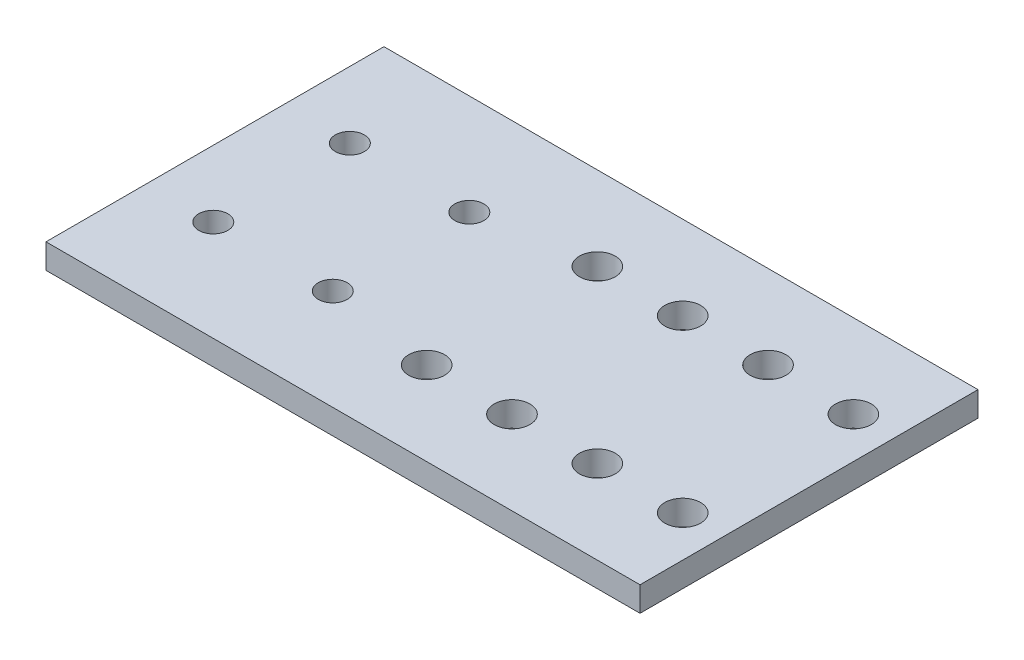
ISO-10303-21;
HEADER;
FILE_DESCRIPTION(('STEP AP214'),'2;1');
FILE_NAME('part.step','',(''),(''),'','','');
FILE_SCHEMA(('AUTOMOTIVE_DESIGN { 1 0 10303 214 1 1 1 1 }'));
ENDSEC;
DATA;
#1=APPLICATION_CONTEXT('core data for automotive mechanical design processes');
#2=APPLICATION_PROTOCOL_DEFINITION('international standard','automotive_design',2000,#1);
#3=PRODUCT_CONTEXT('',#1,'mechanical');
#4=PRODUCT('Part','Part','',(#3));
#5=PRODUCT_RELATED_PRODUCT_CATEGORY('part','',(#4));
#6=PRODUCT_DEFINITION_FORMATION('','',#4);
#7=PRODUCT_DEFINITION_CONTEXT('part definition',#1,'design');
#8=PRODUCT_DEFINITION('design','',#6,#7);
#9=PRODUCT_DEFINITION_SHAPE('','',#8);
#10=(LENGTH_UNIT() NAMED_UNIT(*) SI_UNIT(.MILLI.,.METRE.));
#11=(NAMED_UNIT(*) PLANE_ANGLE_UNIT() SI_UNIT($,.RADIAN.));
#12=(NAMED_UNIT(*) SI_UNIT($,.STERADIAN.) SOLID_ANGLE_UNIT());
#13=UNCERTAINTY_MEASURE_WITH_UNIT(LENGTH_MEASURE(1.E-05),#10,'distance_accuracy_value','');
#14=(GEOMETRIC_REPRESENTATION_CONTEXT(3) GLOBAL_UNCERTAINTY_ASSIGNED_CONTEXT((#13)) GLOBAL_UNIT_ASSIGNED_CONTEXT((#10,
#11,#12)) REPRESENTATION_CONTEXT('',''));
#15=CARTESIAN_POINT('',(0.,0.,0.));
#16=DIRECTION('',(0.,0.,1.));
#17=DIRECTION('',(1.,0.,0.));
#18=AXIS2_PLACEMENT_3D('',#15,#16,#17);
#19=CARTESIAN_POINT('',(0.,2.9,0.));
#20=DIRECTION('',(0.,1.,0.));
#21=DIRECTION('',(0.,0.,1.));
#22=AXIS2_PLACEMENT_3D('',#19,#20,#21);
#23=PLANE('',#22);
#24=CARTESIAN_POINT('',(-5.00000000000025,2.9,-110.));
#25=DIRECTION('',(0.,1.,0.));
#26=DIRECTION('',(0.,0.,1.));
#27=AXIS2_PLACEMENT_3D('',#24,#25,#26);
#28=CIRCLE('',#27,2.1);
#29=CARTESIAN_POINT('',(-5.00000000000025,2.9,-107.9));
#30=VERTEX_POINT('',#29);
#31=EDGE_CURVE('E141',#30,#30,#28,.T.);
#32=ORIENTED_EDGE('',*,*,#31,.F.);
#33=EDGE_LOOP('',(#32));
#34=FACE_BOUND('',#33,.T.);
#35=CARTESIAN_POINT('',(-15.0000000000003,2.9,-110.));
#36=DIRECTION('',(0.,1.,0.));
#37=DIRECTION('',(0.,0.,1.));
#38=AXIS2_PLACEMENT_3D('',#35,#36,#37);
#39=CIRCLE('',#38,2.1);
#40=CARTESIAN_POINT('',(-15.0000000000003,2.9,-107.9));
#41=VERTEX_POINT('',#40);
#42=EDGE_CURVE('E161',#41,#41,#39,.T.);
#43=ORIENTED_EDGE('',*,*,#42,.F.);
#44=EDGE_LOOP('',(#43));
#45=FACE_BOUND('',#44,.T.);
#46=CARTESIAN_POINT('',(-5.00000000000025,2.9,-90.));
#47=DIRECTION('',(0.,1.,0.));
#48=DIRECTION('',(0.,0.,1.));
#49=AXIS2_PLACEMENT_3D('',#46,#47,#48);
#50=CIRCLE('',#49,2.1);
#51=CARTESIAN_POINT('',(-5.00000000000025,2.9,-87.9));
#52=VERTEX_POINT('',#51);
#53=EDGE_CURVE('E157',#52,#52,#50,.F.);
#54=ORIENTED_EDGE('',*,*,#53,.T.);
#55=EDGE_LOOP('',(#54));
#56=FACE_BOUND('',#55,.T.);
#57=CARTESIAN_POINT('',(-15.0000000000003,2.9,-90.));
#58=DIRECTION('',(0.,1.,0.));
#59=DIRECTION('',(0.,0.,1.));
#60=AXIS2_PLACEMENT_3D('',#57,#58,#59);
#61=CIRCLE('',#60,2.1);
#62=CARTESIAN_POINT('',(-15.0000000000003,2.9,-87.9));
#63=VERTEX_POINT('',#62);
#64=EDGE_CURVE('E132',#63,#63,#61,.F.);
#65=ORIENTED_EDGE('',*,*,#64,.T.);
#66=EDGE_LOOP('',(#65));
#67=FACE_BOUND('',#66,.T.);
#68=CARTESIAN_POINT('',(-25.,2.9,-90.));
#69=DIRECTION('',(0.,1.,0.));
#70=DIRECTION('',(0.,0.,1.));
#71=AXIS2_PLACEMENT_3D('',#68,#69,#70);
#72=CIRCLE('',#71,2.1);
#73=CARTESIAN_POINT('',(-25.,2.9,-87.9));
#74=VERTEX_POINT('',#73);
#75=EDGE_CURVE('E181',#74,#74,#72,.F.);
#76=ORIENTED_EDGE('',*,*,#75,.T.);
#77=EDGE_LOOP('',(#76));
#78=FACE_BOUND('',#77,.T.);
#79=CARTESIAN_POINT('',(-62.,2.9,-108.));
#80=DIRECTION('',(0.,1.,0.));
#81=DIRECTION('',(0.,0.,1.));
#82=AXIS2_PLACEMENT_3D('',#79,#80,#81);
#83=CIRCLE('',#82,1.7);
#84=CARTESIAN_POINT('',(-62.,2.9,-106.3));
#85=VERTEX_POINT('',#84);
#86=EDGE_CURVE('E11',#85,#85,#83,.F.);
#87=ORIENTED_EDGE('',*,*,#86,.T.);
#88=EDGE_LOOP('',(#87));
#89=FACE_BOUND('',#88,.T.);
#90=CARTESIAN_POINT('',(-48.,2.9,-92.));
#91=DIRECTION('',(0.,1.,0.));
#92=DIRECTION('',(0.,0.,1.));
#93=AXIS2_PLACEMENT_3D('',#90,#91,#92);
#94=CIRCLE('',#93,1.7);
#95=CARTESIAN_POINT('',(-48.,2.9,-90.3));
#96=VERTEX_POINT('',#95);
#97=EDGE_CURVE('E57',#96,#96,#94,.T.);
#98=ORIENTED_EDGE('',*,*,#97,.F.);
#99=EDGE_LOOP('',(#98));
#100=FACE_BOUND('',#99,.T.);
#101=CARTESIAN_POINT('',(-48.,2.9,-108.));
#102=DIRECTION('',(0.,1.,0.));
#103=DIRECTION('',(0.,0.,1.));
#104=AXIS2_PLACEMENT_3D('',#101,#102,#103);
#105=CIRCLE('',#104,1.7);
#106=CARTESIAN_POINT('',(-48.,2.9,-106.3));
#107=VERTEX_POINT('',#106);
#108=EDGE_CURVE('E204',#107,#107,#105,.F.);
#109=ORIENTED_EDGE('',*,*,#108,.T.);
#110=EDGE_LOOP('',(#109));
#111=FACE_BOUND('',#110,.T.);
#112=CARTESIAN_POINT('',(-62.,2.9,-92.));
#113=DIRECTION('',(0.,1.,0.));
#114=DIRECTION('',(0.,0.,1.));
#115=AXIS2_PLACEMENT_3D('',#112,#113,#114);
#116=CIRCLE('',#115,1.7);
#117=CARTESIAN_POINT('',(-62.,2.9,-90.3));
#118=VERTEX_POINT('',#117);
#119=EDGE_CURVE('E200',#118,#118,#116,.T.);
#120=ORIENTED_EDGE('',*,*,#119,.F.);
#121=EDGE_LOOP('',(#120));
#122=FACE_BOUND('',#121,.T.);
#123=CARTESIAN_POINT('',(-35.,2.9,-110.));
#124=DIRECTION('',(0.,1.,0.));
#125=DIRECTION('',(0.,0.,1.));
#126=AXIS2_PLACEMENT_3D('',#123,#124,#125);
#127=CIRCLE('',#126,2.1);
#128=CARTESIAN_POINT('',(-35.,2.9,-107.9));
#129=VERTEX_POINT('',#128);
#130=EDGE_CURVE('E172',#129,#129,#127,.T.);
#131=ORIENTED_EDGE('',*,*,#130,.F.);
#132=EDGE_LOOP('',(#131));
#133=FACE_BOUND('',#132,.T.);
#134=CARTESIAN_POINT('',(-35.,2.9,-89.9999999999999));
#135=DIRECTION('',(0.,1.,0.));
#136=DIRECTION('',(0.,0.,1.));
#137=AXIS2_PLACEMENT_3D('',#134,#135,#136);
#138=CIRCLE('',#137,2.1);
#139=CARTESIAN_POINT('',(-35.,2.9,-87.8999999999999));
#140=VERTEX_POINT('',#139);
#141=EDGE_CURVE('E173',#140,#140,#138,.F.);
#142=ORIENTED_EDGE('',*,*,#141,.T.);
#143=EDGE_LOOP('',(#142));
#144=FACE_BOUND('',#143,.T.);
#145=CARTESIAN_POINT('',(-25.0000000000003,2.9,-110.));
#146=DIRECTION('',(0.,1.,0.));
#147=DIRECTION('',(0.,0.,1.));
#148=AXIS2_PLACEMENT_3D('',#145,#146,#147);
#149=CIRCLE('',#148,2.10000000000022);
#150=CARTESIAN_POINT('',(-25.0000000000003,2.9,-107.9));
#151=VERTEX_POINT('',#150);
#152=EDGE_CURVE('E153',#151,#151,#149,.T.);
#153=ORIENTED_EDGE('',*,*,#152,.F.);
#154=EDGE_LOOP('',(#153));
#155=FACE_BOUND('',#154,.T.);
#156=DIRECTION('',(0.,0.,-1.));
#157=VECTOR('',#156,1.);
#158=CARTESIAN_POINT('',(-0.200000000000033,2.9,-119.8));
#159=LINE('',#158,#157);
#160=CARTESIAN_POINT('',(-0.200000000000028,2.9,-80.2));
#161=VERTEX_POINT('',#160);
#162=CARTESIAN_POINT('',(-0.200000000000033,2.9,-119.8));
#163=VERTEX_POINT('',#162);
#164=EDGE_CURVE('E97',#161,#163,#159,.T.);
#165=ORIENTED_EDGE('',*,*,#164,.T.);
#166=DIRECTION('',(-1.,0.,0.));
#167=VECTOR('',#166,1.);
#168=CARTESIAN_POINT('',(-69.8,2.9,-119.8));
#169=LINE('',#168,#167);
#170=CARTESIAN_POINT('',(-69.8,2.9,-119.8));
#171=VERTEX_POINT('',#170);
#172=EDGE_CURVE('E119',#163,#171,#169,.T.);
#173=ORIENTED_EDGE('',*,*,#172,.T.);
#174=DIRECTION('',(0.,0.,1.));
#175=VECTOR('',#174,1.);
#176=CARTESIAN_POINT('',(-69.8,2.9,-119.8));
#177=LINE('',#176,#175);
#178=CARTESIAN_POINT('',(-69.8,2.9,-80.2));
#179=VERTEX_POINT('',#178);
#180=EDGE_CURVE('E123',#171,#179,#177,.T.);
#181=ORIENTED_EDGE('',*,*,#180,.T.);
#182=DIRECTION('',(1.,0.,0.));
#183=VECTOR('',#182,1.);
#184=CARTESIAN_POINT('',(-69.8,2.9,-80.2));
#185=LINE('',#184,#183);
#186=EDGE_CURVE('E65',#179,#161,#185,.T.);
#187=ORIENTED_EDGE('',*,*,#186,.T.);
#188=EDGE_LOOP('',(#165,#173,#181,#187));
#189=FACE_BOUND('',#188,.T.);
#190=ADVANCED_FACE('F47',(#34,#45,#56,#67,#78,#89,#100,#111,#122,#133,#144,#155,#189),#23,.T.);
#191=CARTESIAN_POINT('',(0.,0.,0.));
#192=DIRECTION('',(0.,1.,0.));
#193=DIRECTION('',(0.,0.,1.));
#194=AXIS2_PLACEMENT_3D('',#191,#192,#193);
#195=PLANE('',#194);
#196=CARTESIAN_POINT('',(-5.00000000000025,0.,-110.));
#197=DIRECTION('',(0.,1.,0.));
#198=DIRECTION('',(0.,0.,1.));
#199=AXIS2_PLACEMENT_3D('',#196,#197,#198);
#200=CIRCLE('',#199,2.1);
#201=CARTESIAN_POINT('',(-5.00000000000025,0.,-107.9));
#202=VERTEX_POINT('',#201);
#203=EDGE_CURVE('E149',#202,#202,#200,.T.);
#204=ORIENTED_EDGE('',*,*,#203,.T.);
#205=EDGE_LOOP('',(#204));
#206=FACE_BOUND('',#205,.T.);
#207=CARTESIAN_POINT('',(-15.0000000000003,0.,-110.));
#208=DIRECTION('',(0.,1.,0.));
#209=DIRECTION('',(0.,0.,1.));
#210=AXIS2_PLACEMENT_3D('',#207,#208,#209);
#211=CIRCLE('',#210,2.1);
#212=CARTESIAN_POINT('',(-15.0000000000003,0.,-107.9));
#213=VERTEX_POINT('',#212);
#214=EDGE_CURVE('E145',#213,#213,#211,.T.);
#215=ORIENTED_EDGE('',*,*,#214,.T.);
#216=EDGE_LOOP('',(#215));
#217=FACE_BOUND('',#216,.T.);
#218=CARTESIAN_POINT('',(-5.00000000000025,0.,-90.));
#219=DIRECTION('',(0.,1.,0.));
#220=DIRECTION('',(0.,0.,1.));
#221=AXIS2_PLACEMENT_3D('',#218,#219,#220);
#222=CIRCLE('',#221,2.1);
#223=CARTESIAN_POINT('',(-5.00000000000025,0.,-87.9));
#224=VERTEX_POINT('',#223);
#225=EDGE_CURVE('E140',#224,#224,#222,.F.);
#226=ORIENTED_EDGE('',*,*,#225,.F.);
#227=EDGE_LOOP('',(#226));
#228=FACE_BOUND('',#227,.T.);
#229=CARTESIAN_POINT('',(-15.0000000000003,0.,-90.));
#230=DIRECTION('',(0.,1.,0.));
#231=DIRECTION('',(0.,0.,1.));
#232=AXIS2_PLACEMENT_3D('',#229,#230,#231);
#233=CIRCLE('',#232,2.1);
#234=CARTESIAN_POINT('',(-15.0000000000003,0.,-87.9));
#235=VERTEX_POINT('',#234);
#236=EDGE_CURVE('E136',#235,#235,#233,.F.);
#237=ORIENTED_EDGE('',*,*,#236,.F.);
#238=EDGE_LOOP('',(#237));
#239=FACE_BOUND('',#238,.T.);
#240=CARTESIAN_POINT('',(-25.,0.,-90.));
#241=DIRECTION('',(0.,1.,0.));
#242=DIRECTION('',(0.,0.,1.));
#243=AXIS2_PLACEMENT_3D('',#240,#241,#242);
#244=CIRCLE('',#243,2.1);
#245=CARTESIAN_POINT('',(-25.,0.,-87.9));
#246=VERTEX_POINT('',#245);
#247=EDGE_CURVE('E177',#246,#246,#244,.F.);
#248=ORIENTED_EDGE('',*,*,#247,.F.);
#249=EDGE_LOOP('',(#248));
#250=FACE_BOUND('',#249,.T.);
#251=CARTESIAN_POINT('',(-35.,0.,-89.9999999999999));
#252=DIRECTION('',(0.,1.,0.));
#253=DIRECTION('',(0.,0.,1.));
#254=AXIS2_PLACEMENT_3D('',#251,#252,#253);
#255=CIRCLE('',#254,2.1);
#256=CARTESIAN_POINT('',(-35.,0.,-87.8999999999999));
#257=VERTEX_POINT('',#256);
#258=EDGE_CURVE('E168',#257,#257,#255,.F.);
#259=ORIENTED_EDGE('',*,*,#258,.F.);
#260=EDGE_LOOP('',(#259));
#261=FACE_BOUND('',#260,.T.);
#262=CARTESIAN_POINT('',(-62.,0.,-108.));
#263=DIRECTION('',(0.,1.,0.));
#264=DIRECTION('',(0.,0.,1.));
#265=AXIS2_PLACEMENT_3D('',#262,#263,#264);
#266=CIRCLE('',#265,1.7);
#267=CARTESIAN_POINT('',(-62.,0.,-106.3));
#268=VERTEX_POINT('',#267);
#269=EDGE_CURVE('E51',#268,#268,#266,.F.);
#270=ORIENTED_EDGE('',*,*,#269,.F.);
#271=EDGE_LOOP('',(#270));
#272=FACE_BOUND('',#271,.T.);
#273=CARTESIAN_POINT('',(-48.,0.,-92.));
#274=DIRECTION('',(0.,1.,0.));
#275=DIRECTION('',(0.,0.,1.));
#276=AXIS2_PLACEMENT_3D('',#273,#274,#275);
#277=CIRCLE('',#276,1.7);
#278=CARTESIAN_POINT('',(-48.,0.,-90.3));
#279=VERTEX_POINT('',#278);
#280=EDGE_CURVE('E217',#279,#279,#277,.T.);
#281=ORIENTED_EDGE('',*,*,#280,.T.);
#282=EDGE_LOOP('',(#281));
#283=FACE_BOUND('',#282,.T.);
#284=CARTESIAN_POINT('',(-48.,0.,-108.));
#285=DIRECTION('',(0.,1.,0.));
#286=DIRECTION('',(0.,0.,1.));
#287=AXIS2_PLACEMENT_3D('',#284,#285,#286);
#288=CIRCLE('',#287,1.7);
#289=CARTESIAN_POINT('',(-48.,0.,-106.3));
#290=VERTEX_POINT('',#289);
#291=EDGE_CURVE('E214',#290,#290,#288,.F.);
#292=ORIENTED_EDGE('',*,*,#291,.F.);
#293=EDGE_LOOP('',(#292));
#294=FACE_BOUND('',#293,.T.);
#295=CARTESIAN_POINT('',(-62.,0.,-92.));
#296=DIRECTION('',(0.,1.,0.));
#297=DIRECTION('',(0.,0.,1.));
#298=AXIS2_PLACEMENT_3D('',#295,#296,#297);
#299=CIRCLE('',#298,1.7);
#300=CARTESIAN_POINT('',(-62.,0.,-90.3));
#301=VERTEX_POINT('',#300);
#302=EDGE_CURVE('E196',#301,#301,#299,.T.);
#303=ORIENTED_EDGE('',*,*,#302,.T.);
#304=EDGE_LOOP('',(#303));
#305=FACE_BOUND('',#304,.T.);
#306=CARTESIAN_POINT('',(-35.,0.,-110.));
#307=DIRECTION('',(0.,1.,0.));
#308=DIRECTION('',(0.,0.,1.));
#309=AXIS2_PLACEMENT_3D('',#306,#307,#308);
#310=CIRCLE('',#309,2.1);
#311=CARTESIAN_POINT('',(-35.,0.,-107.9));
#312=VERTEX_POINT('',#311);
#313=EDGE_CURVE('E192',#312,#312,#310,.T.);
#314=ORIENTED_EDGE('',*,*,#313,.T.);
#315=EDGE_LOOP('',(#314));
#316=FACE_BOUND('',#315,.T.);
#317=CARTESIAN_POINT('',(-25.0000000000003,0.,-110.));
#318=DIRECTION('',(0.,1.,0.));
#319=DIRECTION('',(0.,0.,1.));
#320=AXIS2_PLACEMENT_3D('',#317,#318,#319);
#321=CIRCLE('',#320,2.10000000000022);
#322=CARTESIAN_POINT('',(-25.0000000000003,0.,-107.9));
#323=VERTEX_POINT('',#322);
#324=EDGE_CURVE('E185',#323,#323,#321,.T.);
#325=ORIENTED_EDGE('',*,*,#324,.T.);
#326=EDGE_LOOP('',(#325));
#327=FACE_BOUND('',#326,.T.);
#328=DIRECTION('',(-1.,0.,0.));
#329=VECTOR('',#328,1.);
#330=CARTESIAN_POINT('',(-69.8,0.,-119.8));
#331=LINE('',#330,#329);
#332=CARTESIAN_POINT('',(-0.200000000000033,0.,-119.8));
#333=VERTEX_POINT('',#332);
#334=CARTESIAN_POINT('',(-69.8,0.,-119.8));
#335=VERTEX_POINT('',#334);
#336=EDGE_CURVE('E73',#333,#335,#331,.T.);
#337=ORIENTED_EDGE('',*,*,#336,.F.);
#338=DIRECTION('',(0.,0.,-1.));
#339=VECTOR('',#338,1.);
#340=CARTESIAN_POINT('',(-0.200000000000033,0.,-119.8));
#341=LINE('',#340,#339);
#342=CARTESIAN_POINT('',(-0.200000000000028,0.,-80.2));
#343=VERTEX_POINT('',#342);
#344=EDGE_CURVE('E95',#343,#333,#341,.T.);
#345=ORIENTED_EDGE('',*,*,#344,.F.);
#346=DIRECTION('',(1.,0.,0.));
#347=VECTOR('',#346,1.);
#348=CARTESIAN_POINT('',(-69.8,0.,-80.2));
#349=LINE('',#348,#347);
#350=CARTESIAN_POINT('',(-69.8,0.,-80.2));
#351=VERTEX_POINT('',#350);
#352=EDGE_CURVE('E103',#351,#343,#349,.T.);
#353=ORIENTED_EDGE('',*,*,#352,.F.);
#354=DIRECTION('',(0.,0.,1.));
#355=VECTOR('',#354,1.);
#356=CARTESIAN_POINT('',(-69.8,0.,-119.8));
#357=LINE('',#356,#355);
#358=EDGE_CURVE('E109',#335,#351,#357,.T.);
#359=ORIENTED_EDGE('',*,*,#358,.F.);
#360=EDGE_LOOP('',(#337,#345,#353,#359));
#361=FACE_BOUND('',#360,.T.);
#362=ADVANCED_FACE('F111',(#206,#217,#228,#239,#250,#261,#272,#283,#294,#305,#316,#327,#361),
#195,.F.);
#363=CARTESIAN_POINT('',(-48.,2.9,-92.));
#364=DIRECTION('',(0.,-1.,0.));
#365=DIRECTION('',(0.,0.,-1.));
#366=AXIS2_PLACEMENT_3D('',#363,#364,#365);
#367=CYLINDRICAL_SURFACE('',#366,1.7);
#368=ORIENTED_EDGE('',*,*,#97,.T.);
#369=EDGE_LOOP('',(#368));
#370=FACE_BOUND('',#369,.T.);
#371=ORIENTED_EDGE('',*,*,#280,.F.);
#372=EDGE_LOOP('',(#371));
#373=FACE_BOUND('',#372,.T.);
#374=ADVANCED_FACE('F229',(#370,#373),#367,.F.);
#375=CARTESIAN_POINT('',(-48.,2.9,-108.));
#376=DIRECTION('',(0.,-1.,0.));
#377=DIRECTION('',(0.,0.,-1.));
#378=AXIS2_PLACEMENT_3D('',#375,#376,#377);
#379=CYLINDRICAL_SURFACE('',#378,1.7);
#380=ORIENTED_EDGE('',*,*,#108,.F.);
#381=EDGE_LOOP('',(#380));
#382=FACE_BOUND('',#381,.T.);
#383=ORIENTED_EDGE('',*,*,#291,.T.);
#384=EDGE_LOOP('',(#383));
#385=FACE_BOUND('',#384,.T.);
#386=ADVANCED_FACE('F300',(#382,#385),#379,.F.);
#387=CARTESIAN_POINT('',(-62.,2.9,-92.));
#388=DIRECTION('',(0.,-1.,0.));
#389=DIRECTION('',(0.,0.,-1.));
#390=AXIS2_PLACEMENT_3D('',#387,#388,#389);
#391=CYLINDRICAL_SURFACE('',#390,1.7);
#392=ORIENTED_EDGE('',*,*,#119,.T.);
#393=EDGE_LOOP('',(#392));
#394=FACE_BOUND('',#393,.T.);
#395=ORIENTED_EDGE('',*,*,#302,.F.);
#396=EDGE_LOOP('',(#395));
#397=FACE_BOUND('',#396,.T.);
#398=ADVANCED_FACE('F49',(#394,#397),#391,.F.);
#399=CARTESIAN_POINT('',(-62.,2.9,-108.));
#400=DIRECTION('',(0.,-1.,0.));
#401=DIRECTION('',(0.,0.,-1.));
#402=AXIS2_PLACEMENT_3D('',#399,#400,#401);
#403=CYLINDRICAL_SURFACE('',#402,1.7);
#404=ORIENTED_EDGE('',*,*,#86,.F.);
#405=EDGE_LOOP('',(#404));
#406=FACE_BOUND('',#405,.T.);
#407=ORIENTED_EDGE('',*,*,#269,.T.);
#408=EDGE_LOOP('',(#407));
#409=FACE_BOUND('',#408,.T.);
#410=ADVANCED_FACE('F226',(#406,#409),#403,.F.);
#411=CARTESIAN_POINT('',(-35.,0.,-110.));
#412=DIRECTION('',(0.,1.,0.));
#413=DIRECTION('',(0.,0.,1.));
#414=AXIS2_PLACEMENT_3D('',#411,#412,#413);
#415=CYLINDRICAL_SURFACE('',#414,2.1);
#416=ORIENTED_EDGE('',*,*,#313,.F.);
#417=EDGE_LOOP('',(#416));
#418=FACE_BOUND('',#417,.T.);
#419=ORIENTED_EDGE('',*,*,#130,.T.);
#420=EDGE_LOOP('',(#419));
#421=FACE_BOUND('',#420,.T.);
#422=ADVANCED_FACE('F288',(#418,#421),#415,.F.);
#423=CARTESIAN_POINT('',(-35.,0.,-89.9999999999999));
#424=DIRECTION('',(0.,1.,0.));
#425=DIRECTION('',(0.,0.,1.));
#426=AXIS2_PLACEMENT_3D('',#423,#424,#425);
#427=CYLINDRICAL_SURFACE('',#426,2.1);
#428=ORIENTED_EDGE('',*,*,#258,.T.);
#429=EDGE_LOOP('',(#428));
#430=FACE_BOUND('',#429,.T.);
#431=ORIENTED_EDGE('',*,*,#141,.F.);
#432=EDGE_LOOP('',(#431));
#433=FACE_BOUND('',#432,.T.);
#434=ADVANCED_FACE('F285',(#430,#433),#427,.F.);
#435=CARTESIAN_POINT('',(-25.,0.,-90.));
#436=DIRECTION('',(0.,1.,0.));
#437=DIRECTION('',(0.,0.,1.));
#438=AXIS2_PLACEMENT_3D('',#435,#436,#437);
#439=CYLINDRICAL_SURFACE('',#438,2.1);
#440=ORIENTED_EDGE('',*,*,#247,.T.);
#441=EDGE_LOOP('',(#440));
#442=FACE_BOUND('',#441,.T.);
#443=ORIENTED_EDGE('',*,*,#75,.F.);
#444=EDGE_LOOP('',(#443));
#445=FACE_BOUND('',#444,.T.);
#446=ADVANCED_FACE('F245',(#442,#445),#439,.F.);
#447=CARTESIAN_POINT('',(-25.0000000000003,0.,-110.));
#448=DIRECTION('',(0.,1.,0.));
#449=DIRECTION('',(0.,0.,1.));
#450=AXIS2_PLACEMENT_3D('',#447,#448,#449);
#451=CYLINDRICAL_SURFACE('',#450,2.10000000000022);
#452=ORIENTED_EDGE('',*,*,#324,.F.);
#453=EDGE_LOOP('',(#452));
#454=FACE_BOUND('',#453,.T.);
#455=ORIENTED_EDGE('',*,*,#152,.T.);
#456=EDGE_LOOP('',(#455));
#457=FACE_BOUND('',#456,.T.);
#458=ADVANCED_FACE('F241',(#454,#457),#451,.F.);
#459=CARTESIAN_POINT('',(-15.0000000000003,0.,-110.));
#460=DIRECTION('',(0.,1.,0.));
#461=DIRECTION('',(0.,0.,1.));
#462=AXIS2_PLACEMENT_3D('',#459,#460,#461);
#463=CYLINDRICAL_SURFACE('',#462,2.1);
#464=ORIENTED_EDGE('',*,*,#214,.F.);
#465=EDGE_LOOP('',(#464));
#466=FACE_BOUND('',#465,.T.);
#467=ORIENTED_EDGE('',*,*,#42,.T.);
#468=EDGE_LOOP('',(#467));
#469=FACE_BOUND('',#468,.T.);
#470=ADVANCED_FACE('F244',(#466,#469),#463,.F.);
#471=CARTESIAN_POINT('',(-5.00000000000025,0.,-90.));
#472=DIRECTION('',(0.,1.,0.));
#473=DIRECTION('',(0.,0.,1.));
#474=AXIS2_PLACEMENT_3D('',#471,#472,#473);
#475=CYLINDRICAL_SURFACE('',#474,2.1);
#476=ORIENTED_EDGE('',*,*,#225,.T.);
#477=EDGE_LOOP('',(#476));
#478=FACE_BOUND('',#477,.T.);
#479=ORIENTED_EDGE('',*,*,#53,.F.);
#480=EDGE_LOOP('',(#479));
#481=FACE_BOUND('',#480,.T.);
#482=ADVANCED_FACE('F277',(#478,#481),#475,.F.);
#483=CARTESIAN_POINT('',(-15.0000000000003,0.,-90.));
#484=DIRECTION('',(0.,1.,0.));
#485=DIRECTION('',(0.,0.,1.));
#486=AXIS2_PLACEMENT_3D('',#483,#484,#485);
#487=CYLINDRICAL_SURFACE('',#486,2.1);
#488=ORIENTED_EDGE('',*,*,#236,.T.);
#489=EDGE_LOOP('',(#488));
#490=FACE_BOUND('',#489,.T.);
#491=ORIENTED_EDGE('',*,*,#64,.F.);
#492=EDGE_LOOP('',(#491));
#493=FACE_BOUND('',#492,.T.);
#494=ADVANCED_FACE('F269',(#490,#493),#487,.F.);
#495=CARTESIAN_POINT('',(-5.00000000000025,0.,-110.));
#496=DIRECTION('',(0.,1.,0.));
#497=DIRECTION('',(0.,0.,1.));
#498=AXIS2_PLACEMENT_3D('',#495,#496,#497);
#499=CYLINDRICAL_SURFACE('',#498,2.1);
#500=ORIENTED_EDGE('',*,*,#203,.F.);
#501=EDGE_LOOP('',(#500));
#502=FACE_BOUND('',#501,.T.);
#503=ORIENTED_EDGE('',*,*,#31,.T.);
#504=EDGE_LOOP('',(#503));
#505=FACE_BOUND('',#504,.T.);
#506=ADVANCED_FACE('F262',(#502,#505),#499,.F.);
#507=CARTESIAN_POINT('',(-69.8,0.,-119.8));
#508=DIRECTION('',(0.,0.,-1.));
#509=DIRECTION('',(-1.,0.,0.));
#510=AXIS2_PLACEMENT_3D('',#507,#508,#509);
#511=PLANE('',#510);
#512=ORIENTED_EDGE('',*,*,#172,.F.);
#513=DIRECTION('',(0.,1.,0.));
#514=VECTOR('',#513,1.);
#515=CARTESIAN_POINT('',(-0.200000000000033,0.,-119.8));
#516=LINE('',#515,#514);
#517=EDGE_CURVE('E99',#333,#163,#516,.T.);
#518=ORIENTED_EDGE('',*,*,#517,.F.);
#519=ORIENTED_EDGE('',*,*,#336,.T.);
#520=DIRECTION('',(0.,1.,0.));
#521=VECTOR('',#520,1.);
#522=CARTESIAN_POINT('',(-69.8,0.,-119.8));
#523=LINE('',#522,#521);
#524=EDGE_CURVE('E113',#335,#171,#523,.T.);
#525=ORIENTED_EDGE('',*,*,#524,.T.);
#526=EDGE_LOOP('',(#512,#518,#519,#525));
#527=FACE_BOUND('',#526,.T.);
#528=ADVANCED_FACE('F260',(#527),#511,.T.);
#529=CARTESIAN_POINT('',(-0.200000000000033,0.,-119.8));
#530=DIRECTION('',(1.,0.,0.));
#531=DIRECTION('',(0.,0.,-1.));
#532=AXIS2_PLACEMENT_3D('',#529,#530,#531);
#533=PLANE('',#532);
#534=ORIENTED_EDGE('',*,*,#164,.F.);
#535=DIRECTION('',(0.,1.,0.));
#536=VECTOR('',#535,1.);
#537=CARTESIAN_POINT('',(-0.200000000000028,0.,-80.2));
#538=LINE('',#537,#536);
#539=EDGE_CURVE('E91',#343,#161,#538,.T.);
#540=ORIENTED_EDGE('',*,*,#539,.F.);
#541=ORIENTED_EDGE('',*,*,#344,.T.);
#542=ORIENTED_EDGE('',*,*,#517,.T.);
#543=EDGE_LOOP('',(#534,#540,#541,#542));
#544=FACE_BOUND('',#543,.T.);
#545=ADVANCED_FACE('F93',(#544),#533,.T.);
#546=CARTESIAN_POINT('',(-69.8,0.,-80.2));
#547=DIRECTION('',(0.,0.,1.));
#548=DIRECTION('',(1.,0.,0.));
#549=AXIS2_PLACEMENT_3D('',#546,#547,#548);
#550=PLANE('',#549);
#551=ORIENTED_EDGE('',*,*,#186,.F.);
#552=DIRECTION('',(0.,1.,0.));
#553=VECTOR('',#552,1.);
#554=CARTESIAN_POINT('',(-69.8,0.,-80.2));
#555=LINE('',#554,#553);
#556=EDGE_CURVE('E100',#351,#179,#555,.T.);
#557=ORIENTED_EDGE('',*,*,#556,.F.);
#558=ORIENTED_EDGE('',*,*,#352,.T.);
#559=ORIENTED_EDGE('',*,*,#539,.T.);
#560=EDGE_LOOP('',(#551,#557,#558,#559));
#561=FACE_BOUND('',#560,.T.);
#562=ADVANCED_FACE('F104',(#561),#550,.T.);
#563=CARTESIAN_POINT('',(-69.8,0.,-119.8));
#564=DIRECTION('',(-1.,0.,0.));
#565=DIRECTION('',(0.,0.,1.));
#566=AXIS2_PLACEMENT_3D('',#563,#564,#565);
#567=PLANE('',#566);
#568=ORIENTED_EDGE('',*,*,#180,.F.);
#569=ORIENTED_EDGE('',*,*,#524,.F.);
#570=ORIENTED_EDGE('',*,*,#358,.T.);
#571=ORIENTED_EDGE('',*,*,#556,.T.);
#572=EDGE_LOOP('',(#568,#569,#570,#571));
#573=FACE_BOUND('',#572,.T.);
#574=ADVANCED_FACE('F256',(#573),#567,.T.);
#575=CLOSED_SHELL('',(#190,#362,#374,#386,#398,#410,#422,#434,#446,#458,#470,#482,#494,#506,
#528,#545,#562,#574));
#576=MANIFOLD_SOLID_BREP('B2',#575);
#577=ADVANCED_BREP_SHAPE_REPRESENTATION('',(#18,#576),#14);
#578=SHAPE_DEFINITION_REPRESENTATION(#9,#577);
ENDSEC;
END-ISO-10303-21;
